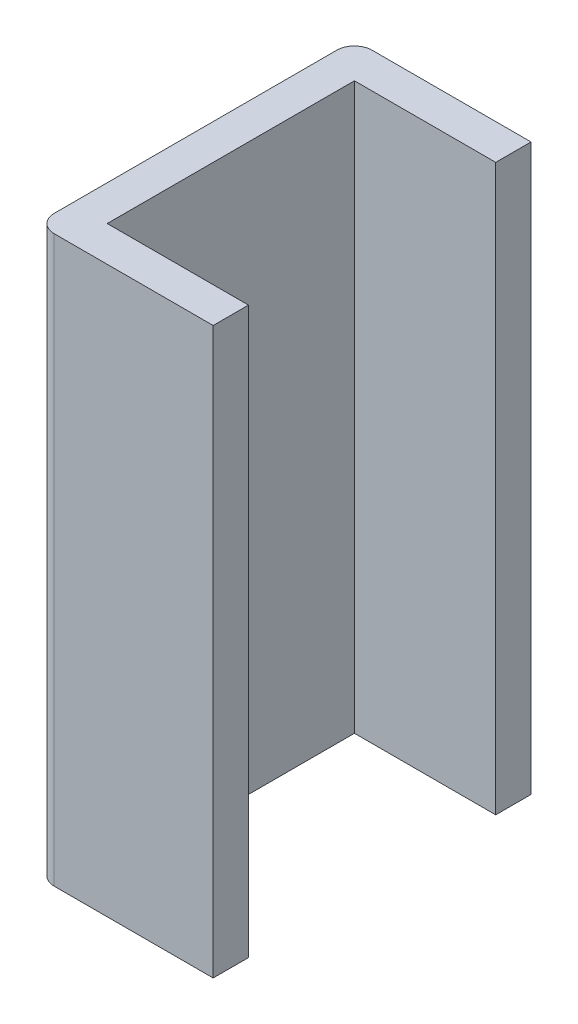
ISO-10303-21;
HEADER;
FILE_DESCRIPTION(('STEP AP214'),'2;1');
FILE_NAME('part.step','',(''),(''),'','','');
FILE_SCHEMA(('AUTOMOTIVE_DESIGN { 1 0 10303 214 1 1 1 1 }'));
ENDSEC;
DATA;
#1=APPLICATION_CONTEXT('core data for automotive mechanical design processes');
#2=APPLICATION_PROTOCOL_DEFINITION('international standard','automotive_design',2000,#1);
#3=PRODUCT_CONTEXT('',#1,'mechanical');
#4=PRODUCT('Part','Part','',(#3));
#5=PRODUCT_RELATED_PRODUCT_CATEGORY('part','',(#4));
#6=PRODUCT_DEFINITION_FORMATION('','',#4);
#7=PRODUCT_DEFINITION_CONTEXT('part definition',#1,'design');
#8=PRODUCT_DEFINITION('design','',#6,#7);
#9=PRODUCT_DEFINITION_SHAPE('','',#8);
#10=(LENGTH_UNIT() NAMED_UNIT(*) SI_UNIT(.MILLI.,.METRE.));
#11=(NAMED_UNIT(*) PLANE_ANGLE_UNIT() SI_UNIT($,.RADIAN.));
#12=(NAMED_UNIT(*) SI_UNIT($,.STERADIAN.) SOLID_ANGLE_UNIT());
#13=UNCERTAINTY_MEASURE_WITH_UNIT(LENGTH_MEASURE(1.E-05),#10,'distance_accuracy_value','');
#14=(GEOMETRIC_REPRESENTATION_CONTEXT(3) GLOBAL_UNCERTAINTY_ASSIGNED_CONTEXT((#13)) GLOBAL_UNIT_ASSIGNED_CONTEXT((#10,
#11,#12)) REPRESENTATION_CONTEXT('',''));
#15=CARTESIAN_POINT('',(0.,0.,0.));
#16=DIRECTION('',(0.,0.,1.));
#17=DIRECTION('',(1.,0.,0.));
#18=AXIS2_PLACEMENT_3D('',#15,#16,#17);
#19=CARTESIAN_POINT('',(-0.675,-0.4,0.45));
#20=DIRECTION('',(0.,0.,1.));
#21=DIRECTION('',(1.,0.,0.));
#22=AXIS2_PLACEMENT_3D('',#19,#20,#21);
#23=PLANE('',#22);
#24=DIRECTION('',(1.,0.,0.));
#25=VECTOR('',#24,1.);
#26=CARTESIAN_POINT('',(-0.675,-0.4,0.45));
#27=LINE('',#26,#25);
#28=CARTESIAN_POINT('',(-0.55,-0.4,0.45));
#29=VERTEX_POINT('',#28);
#30=CARTESIAN_POINT('',(-0.775,-0.4,0.45));
#31=VERTEX_POINT('',#30);
#32=EDGE_CURVE('E77',#29,#31,#27,.F.);
#33=ORIENTED_EDGE('',*,*,#32,.F.);
#34=DIRECTION('',(0.,1.,0.));
#35=VECTOR('',#34,1.);
#36=CARTESIAN_POINT('',(-0.55,-0.4,0.45));
#37=LINE('',#36,#35);
#38=CARTESIAN_POINT('',(-0.55,0.4,0.45));
#39=VERTEX_POINT('',#38);
#40=EDGE_CURVE('E85',#29,#39,#37,.T.);
#41=ORIENTED_EDGE('',*,*,#40,.T.);
#42=DIRECTION('',(1.,0.,0.));
#43=VECTOR('',#42,1.);
#44=CARTESIAN_POINT('',(-0.675,0.4,0.45));
#45=LINE('',#44,#43);
#46=CARTESIAN_POINT('',(-0.775,0.4,0.45));
#47=VERTEX_POINT('',#46);
#48=EDGE_CURVE('E140',#39,#47,#45,.F.);
#49=ORIENTED_EDGE('',*,*,#48,.T.);
#50=DIRECTION('',(0.,1.,0.));
#51=VECTOR('',#50,1.);
#52=CARTESIAN_POINT('',(-0.775,-0.4,0.45));
#53=LINE('',#52,#51);
#54=EDGE_CURVE('E143',#31,#47,#53,.T.);
#55=ORIENTED_EDGE('',*,*,#54,.F.);
#56=EDGE_LOOP('',(#33,#41,#49,#55));
#57=FACE_BOUND('',#56,.T.);
#58=ADVANCED_FACE('F16',(#57),#23,.T.);
#59=CARTESIAN_POINT('',(-0.675,-0.4,0.));
#60=DIRECTION('',(0.,0.,1.));
#61=DIRECTION('',(1.,0.,0.));
#62=AXIS2_PLACEMENT_3D('',#59,#60,#61);
#63=PLANE('',#62);
#64=DIRECTION('',(0.,-1.,0.));
#65=VECTOR('',#64,1.);
#66=CARTESIAN_POINT('',(-0.775,-0.4,0.));
#67=LINE('',#66,#65);
#68=CARTESIAN_POINT('',(-0.775,0.4,0.));
#69=VERTEX_POINT('',#68);
#70=CARTESIAN_POINT('',(-0.775,-0.4,0.));
#71=VERTEX_POINT('',#70);
#72=EDGE_CURVE('E71',#69,#71,#67,.T.);
#73=ORIENTED_EDGE('',*,*,#72,.F.);
#74=DIRECTION('',(1.,0.,0.));
#75=VECTOR('',#74,1.);
#76=CARTESIAN_POINT('',(-0.675,0.4,0.));
#77=LINE('',#76,#75);
#78=CARTESIAN_POINT('',(-0.55,0.4,0.));
#79=VERTEX_POINT('',#78);
#80=EDGE_CURVE('E123',#69,#79,#77,.T.);
#81=ORIENTED_EDGE('',*,*,#80,.T.);
#82=DIRECTION('',(0.,1.,0.));
#83=VECTOR('',#82,1.);
#84=CARTESIAN_POINT('',(-0.55,-0.4,0.));
#85=LINE('',#84,#83);
#86=CARTESIAN_POINT('',(-0.55,-0.4,0.));
#87=VERTEX_POINT('',#86);
#88=EDGE_CURVE('E117',#79,#87,#85,.F.);
#89=ORIENTED_EDGE('',*,*,#88,.T.);
#90=DIRECTION('',(1.,0.,0.));
#91=VECTOR('',#90,1.);
#92=CARTESIAN_POINT('',(-0.675,-0.4,0.));
#93=LINE('',#92,#91);
#94=EDGE_CURVE('E124',#71,#87,#93,.T.);
#95=ORIENTED_EDGE('',*,*,#94,.F.);
#96=EDGE_LOOP('',(#73,#81,#89,#95));
#97=FACE_BOUND('',#96,.T.);
#98=ADVANCED_FACE('F122',(#97),#63,.F.);
#99=CARTESIAN_POINT('',(-0.55,-0.4,0.0249999999999994));
#100=DIRECTION('',(-1.,0.,0.));
#101=DIRECTION('',(0.,0.,1.));
#102=AXIS2_PLACEMENT_3D('',#99,#100,#101);
#103=PLANE('',#102);
#104=DIRECTION('',(0.,1.,0.));
#105=VECTOR('',#104,1.);
#106=CARTESIAN_POINT('',(-0.55,-0.4,0.0499999999999989));
#107=LINE('',#106,#105);
#108=CARTESIAN_POINT('',(-0.55,0.4,0.0499999999999989));
#109=VERTEX_POINT('',#108);
#110=CARTESIAN_POINT('',(-0.55,-0.4,0.0499999999999989));
#111=VERTEX_POINT('',#110);
#112=EDGE_CURVE('E110',#109,#111,#107,.F.);
#113=ORIENTED_EDGE('',*,*,#112,.T.);
#114=DIRECTION('',(0.,0.,-1.));
#115=VECTOR('',#114,1.);
#116=CARTESIAN_POINT('',(-0.55,-0.4,0.225));
#117=LINE('',#116,#115);
#118=EDGE_CURVE('E152',#87,#111,#117,.F.);
#119=ORIENTED_EDGE('',*,*,#118,.F.);
#120=ORIENTED_EDGE('',*,*,#88,.F.);
#121=DIRECTION('',(0.,0.,-1.));
#122=VECTOR('',#121,1.);
#123=CARTESIAN_POINT('',(-0.55,0.4,0.225));
#124=LINE('',#123,#122);
#125=EDGE_CURVE('E128',#79,#109,#124,.F.);
#126=ORIENTED_EDGE('',*,*,#125,.T.);
#127=EDGE_LOOP('',(#113,#119,#120,#126));
#128=FACE_BOUND('',#127,.T.);
#129=ADVANCED_FACE('F237',(#128),#103,.F.);
#130=CARTESIAN_POINT('',(-0.65,-0.4,0.0499999999999989));
#131=DIRECTION('',(0.,0.,-1.));
#132=DIRECTION('',(-1.,0.,0.));
#133=AXIS2_PLACEMENT_3D('',#130,#131,#132);
#134=PLANE('',#133);
#135=DIRECTION('',(0.,1.,0.));
#136=VECTOR('',#135,1.);
#137=CARTESIAN_POINT('',(-0.75,-0.4,0.0499999999999988));
#138=LINE('',#137,#136);
#139=CARTESIAN_POINT('',(-0.75,0.4,0.0499999999999989));
#140=VERTEX_POINT('',#139);
#141=CARTESIAN_POINT('',(-0.75,-0.4,0.0499999999999988));
#142=VERTEX_POINT('',#141);
#143=EDGE_CURVE('E181',#140,#142,#138,.F.);
#144=ORIENTED_EDGE('',*,*,#143,.T.);
#145=DIRECTION('',(1.,0.,0.));
#146=VECTOR('',#145,1.);
#147=CARTESIAN_POINT('',(-0.675,-0.4,0.0499999999999989));
#148=LINE('',#147,#146);
#149=EDGE_CURVE('E154',#111,#142,#148,.F.);
#150=ORIENTED_EDGE('',*,*,#149,.F.);
#151=ORIENTED_EDGE('',*,*,#112,.F.);
#152=DIRECTION('',(1.,0.,0.));
#153=VECTOR('',#152,1.);
#154=CARTESIAN_POINT('',(-0.675,0.4,0.0499999999999989));
#155=LINE('',#154,#153);
#156=EDGE_CURVE('E186',#109,#140,#155,.F.);
#157=ORIENTED_EDGE('',*,*,#156,.T.);
#158=EDGE_LOOP('',(#144,#150,#151,#157));
#159=FACE_BOUND('',#158,.T.);
#160=ADVANCED_FACE('F236',(#159),#134,.F.);
#161=CARTESIAN_POINT('',(-0.75,-0.4,0.225));
#162=DIRECTION('',(-1.,0.,0.));
#163=DIRECTION('',(0.,0.,1.));
#164=AXIS2_PLACEMENT_3D('',#161,#162,#163);
#165=PLANE('',#164);
#166=DIRECTION('',(0.,1.,0.));
#167=VECTOR('',#166,1.);
#168=CARTESIAN_POINT('',(-0.75,-0.4,0.4));
#169=LINE('',#168,#167);
#170=CARTESIAN_POINT('',(-0.75,0.4,0.4));
#171=VERTEX_POINT('',#170);
#172=CARTESIAN_POINT('',(-0.75,-0.4,0.4));
#173=VERTEX_POINT('',#172);
#174=EDGE_CURVE('E171',#171,#173,#169,.F.);
#175=ORIENTED_EDGE('',*,*,#174,.T.);
#176=DIRECTION('',(0.,0.,-1.));
#177=VECTOR('',#176,1.);
#178=CARTESIAN_POINT('',(-0.75,-0.4,0.225));
#179=LINE('',#178,#177);
#180=EDGE_CURVE('E203',#142,#173,#179,.F.);
#181=ORIENTED_EDGE('',*,*,#180,.F.);
#182=ORIENTED_EDGE('',*,*,#143,.F.);
#183=DIRECTION('',(0.,0.,-1.));
#184=VECTOR('',#183,1.);
#185=CARTESIAN_POINT('',(-0.75,0.4,0.225));
#186=LINE('',#185,#184);
#187=EDGE_CURVE('E176',#140,#171,#186,.F.);
#188=ORIENTED_EDGE('',*,*,#187,.T.);
#189=EDGE_LOOP('',(#175,#181,#182,#188));
#190=FACE_BOUND('',#189,.T.);
#191=ADVANCED_FACE('F234',(#190),#165,.F.);
#192=CARTESIAN_POINT('',(-0.65,-0.4,0.4));
#193=DIRECTION('',(0.,0.,1.));
#194=DIRECTION('',(1.,0.,0.));
#195=AXIS2_PLACEMENT_3D('',#192,#193,#194);
#196=PLANE('',#195);
#197=DIRECTION('',(0.,1.,0.));
#198=VECTOR('',#197,1.);
#199=CARTESIAN_POINT('',(-0.55,-0.4,0.4));
#200=LINE('',#199,#198);
#201=CARTESIAN_POINT('',(-0.55,0.4,0.4));
#202=VERTEX_POINT('',#201);
#203=CARTESIAN_POINT('',(-0.55,-0.4,0.4));
#204=VERTEX_POINT('',#203);
#205=EDGE_CURVE('E162',#202,#204,#200,.F.);
#206=ORIENTED_EDGE('',*,*,#205,.T.);
#207=DIRECTION('',(1.,0.,0.));
#208=VECTOR('',#207,1.);
#209=CARTESIAN_POINT('',(-0.675,-0.4,0.4));
#210=LINE('',#209,#208);
#211=EDGE_CURVE('E136',#173,#204,#210,.T.);
#212=ORIENTED_EDGE('',*,*,#211,.F.);
#213=ORIENTED_EDGE('',*,*,#174,.F.);
#214=DIRECTION('',(1.,0.,0.));
#215=VECTOR('',#214,1.);
#216=CARTESIAN_POINT('',(-0.675,0.4,0.4));
#217=LINE('',#216,#215);
#218=EDGE_CURVE('E166',#171,#202,#217,.T.);
#219=ORIENTED_EDGE('',*,*,#218,.T.);
#220=EDGE_LOOP('',(#206,#212,#213,#219));
#221=FACE_BOUND('',#220,.T.);
#222=ADVANCED_FACE('F231',(#221),#196,.F.);
#223=CARTESIAN_POINT('',(-0.55,-0.4,0.425));
#224=DIRECTION('',(-1.,0.,0.));
#225=DIRECTION('',(0.,0.,1.));
#226=AXIS2_PLACEMENT_3D('',#223,#224,#225);
#227=PLANE('',#226);
#228=ORIENTED_EDGE('',*,*,#40,.F.);
#229=DIRECTION('',(0.,0.,-1.));
#230=VECTOR('',#229,1.);
#231=CARTESIAN_POINT('',(-0.55,-0.4,0.225));
#232=LINE('',#231,#230);
#233=EDGE_CURVE('E133',#204,#29,#232,.F.);
#234=ORIENTED_EDGE('',*,*,#233,.F.);
#235=ORIENTED_EDGE('',*,*,#205,.F.);
#236=DIRECTION('',(0.,0.,-1.));
#237=VECTOR('',#236,1.);
#238=CARTESIAN_POINT('',(-0.55,0.4,0.225));
#239=LINE('',#238,#237);
#240=EDGE_CURVE('E144',#202,#39,#239,.F.);
#241=ORIENTED_EDGE('',*,*,#240,.T.);
#242=EDGE_LOOP('',(#228,#234,#235,#241));
#243=FACE_BOUND('',#242,.T.);
#244=ADVANCED_FACE('F228',(#243),#227,.F.);
#245=CARTESIAN_POINT('',(-0.775,-0.4,0.025));
#246=DIRECTION('',(0.,-1.,0.));
#247=DIRECTION('',(0.,0.,-1.));
#248=AXIS2_PLACEMENT_3D('',#245,#246,#247);
#249=CYLINDRICAL_SURFACE('',#248,0.025);
#250=CARTESIAN_POINT('',(-0.775,0.4,0.025));
#251=DIRECTION('',(0.,-1.,0.));
#252=DIRECTION('',(0.,0.,-1.));
#253=AXIS2_PLACEMENT_3D('',#250,#251,#252);
#254=CIRCLE('',#253,0.025);
#255=CARTESIAN_POINT('',(-0.8,0.4,0.025));
#256=VERTEX_POINT('',#255);
#257=EDGE_CURVE('E19',#256,#69,#254,.T.);
#258=ORIENTED_EDGE('',*,*,#257,.T.);
#259=ORIENTED_EDGE('',*,*,#72,.T.);
#260=CARTESIAN_POINT('',(-0.775,-0.4,0.025));
#261=DIRECTION('',(0.,-1.,0.));
#262=DIRECTION('',(0.,0.,-1.));
#263=AXIS2_PLACEMENT_3D('',#260,#261,#262);
#264=CIRCLE('',#263,0.025);
#265=CARTESIAN_POINT('',(-0.8,-0.4,0.025));
#266=VERTEX_POINT('',#265);
#267=EDGE_CURVE('E131',#266,#71,#264,.T.);
#268=ORIENTED_EDGE('',*,*,#267,.F.);
#269=DIRECTION('',(0.,1.,0.));
#270=VECTOR('',#269,1.);
#271=CARTESIAN_POINT('',(-0.8,-0.4,0.025));
#272=LINE('',#271,#270);
#273=EDGE_CURVE('E58',#266,#256,#272,.T.);
#274=ORIENTED_EDGE('',*,*,#273,.T.);
#275=EDGE_LOOP('',(#258,#259,#268,#274));
#276=FACE_BOUND('',#275,.T.);
#277=ADVANCED_FACE('F130',(#276),#249,.T.);
#278=CARTESIAN_POINT('',(-0.675,0.4,0.225));
#279=DIRECTION('',(0.,-1.,0.));
#280=DIRECTION('',(0.,0.,-1.));
#281=AXIS2_PLACEMENT_3D('',#278,#279,#280);
#282=PLANE('',#281);
#283=CARTESIAN_POINT('',(-0.775,0.4,0.425));
#284=DIRECTION('',(0.,1.,0.));
#285=DIRECTION('',(0.,0.,1.));
#286=AXIS2_PLACEMENT_3D('',#283,#284,#285);
#287=CIRCLE('',#286,0.025);
#288=CARTESIAN_POINT('',(-0.8,0.4,0.425));
#289=VERTEX_POINT('',#288);
#290=EDGE_CURVE('E157',#47,#289,#287,.F.);
#291=ORIENTED_EDGE('',*,*,#290,.F.);
#292=ORIENTED_EDGE('',*,*,#48,.F.);
#293=ORIENTED_EDGE('',*,*,#240,.F.);
#294=ORIENTED_EDGE('',*,*,#218,.F.);
#295=ORIENTED_EDGE('',*,*,#187,.F.);
#296=ORIENTED_EDGE('',*,*,#156,.F.);
#297=ORIENTED_EDGE('',*,*,#125,.F.);
#298=ORIENTED_EDGE('',*,*,#80,.F.);
#299=ORIENTED_EDGE('',*,*,#257,.F.);
#300=DIRECTION('',(0.,0.,-1.));
#301=VECTOR('',#300,1.);
#302=CARTESIAN_POINT('',(-0.8,0.4,0.225));
#303=LINE('',#302,#301);
#304=EDGE_CURVE('E132',#256,#289,#303,.F.);
#305=ORIENTED_EDGE('',*,*,#304,.T.);
#306=EDGE_LOOP('',(#291,#292,#293,#294,#295,#296,#297,#298,#299,#305));
#307=FACE_BOUND('',#306,.T.);
#308=ADVANCED_FACE('F127',(#307),#282,.F.);
#309=CARTESIAN_POINT('',(-0.775,-0.4,0.425));
#310=DIRECTION('',(0.,1.,0.));
#311=DIRECTION('',(0.,0.,1.));
#312=AXIS2_PLACEMENT_3D('',#309,#310,#311);
#313=CYLINDRICAL_SURFACE('',#312,0.025);
#314=ORIENTED_EDGE('',*,*,#290,.T.);
#315=DIRECTION('',(0.,1.,0.));
#316=VECTOR('',#315,1.);
#317=CARTESIAN_POINT('',(-0.8,-0.4,0.425));
#318=LINE('',#317,#316);
#319=CARTESIAN_POINT('',(-0.8,-0.4,0.425));
#320=VERTEX_POINT('',#319);
#321=EDGE_CURVE('E25',#289,#320,#318,.F.);
#322=ORIENTED_EDGE('',*,*,#321,.T.);
#323=CARTESIAN_POINT('',(-0.775,-0.4,0.425));
#324=DIRECTION('',(0.,1.,0.));
#325=DIRECTION('',(0.,0.,1.));
#326=AXIS2_PLACEMENT_3D('',#323,#324,#325);
#327=CIRCLE('',#326,0.025);
#328=EDGE_CURVE('E33',#31,#320,#327,.F.);
#329=ORIENTED_EDGE('',*,*,#328,.F.);
#330=ORIENTED_EDGE('',*,*,#54,.T.);
#331=EDGE_LOOP('',(#314,#322,#329,#330));
#332=FACE_BOUND('',#331,.T.);
#333=ADVANCED_FACE('F222',(#332),#313,.T.);
#334=CARTESIAN_POINT('',(-0.675,-0.4,0.225));
#335=DIRECTION('',(0.,-1.,0.));
#336=DIRECTION('',(0.,0.,-1.));
#337=AXIS2_PLACEMENT_3D('',#334,#335,#336);
#338=PLANE('',#337);
#339=ORIENTED_EDGE('',*,*,#211,.T.);
#340=ORIENTED_EDGE('',*,*,#233,.T.);
#341=ORIENTED_EDGE('',*,*,#32,.T.);
#342=ORIENTED_EDGE('',*,*,#328,.T.);
#343=DIRECTION('',(0.,0.,-1.));
#344=VECTOR('',#343,1.);
#345=CARTESIAN_POINT('',(-0.8,-0.4,0.225));
#346=LINE('',#345,#344);
#347=EDGE_CURVE('E11',#320,#266,#346,.T.);
#348=ORIENTED_EDGE('',*,*,#347,.T.);
#349=ORIENTED_EDGE('',*,*,#267,.T.);
#350=ORIENTED_EDGE('',*,*,#94,.T.);
#351=ORIENTED_EDGE('',*,*,#118,.T.);
#352=ORIENTED_EDGE('',*,*,#149,.T.);
#353=ORIENTED_EDGE('',*,*,#180,.T.);
#354=EDGE_LOOP('',(#339,#340,#341,#342,#348,#349,#350,#351,#352,#353));
#355=FACE_BOUND('',#354,.T.);
#356=ADVANCED_FACE('F238',(#355),#338,.T.);
#357=CARTESIAN_POINT('',(-0.8,-0.4,0.225));
#358=DIRECTION('',(1.,0.,0.));
#359=DIRECTION('',(0.,0.,-1.));
#360=AXIS2_PLACEMENT_3D('',#357,#358,#359);
#361=PLANE('',#360);
#362=ORIENTED_EDGE('',*,*,#321,.F.);
#363=ORIENTED_EDGE('',*,*,#304,.F.);
#364=ORIENTED_EDGE('',*,*,#273,.F.);
#365=ORIENTED_EDGE('',*,*,#347,.F.);
#366=EDGE_LOOP('',(#362,#363,#364,#365));
#367=FACE_BOUND('',#366,.T.);
#368=ADVANCED_FACE('F223',(#367),#361,.F.);
#369=CLOSED_SHELL('',(#58,#98,#129,#160,#191,#222,#244,#277,#308,#333,#356,#368));
#370=MANIFOLD_SOLID_BREP('B1',#369);
#371=ADVANCED_BREP_SHAPE_REPRESENTATION('',(#18,#370),#14);
#372=SHAPE_DEFINITION_REPRESENTATION(#9,#371);
ENDSEC;
END-ISO-10303-21;
